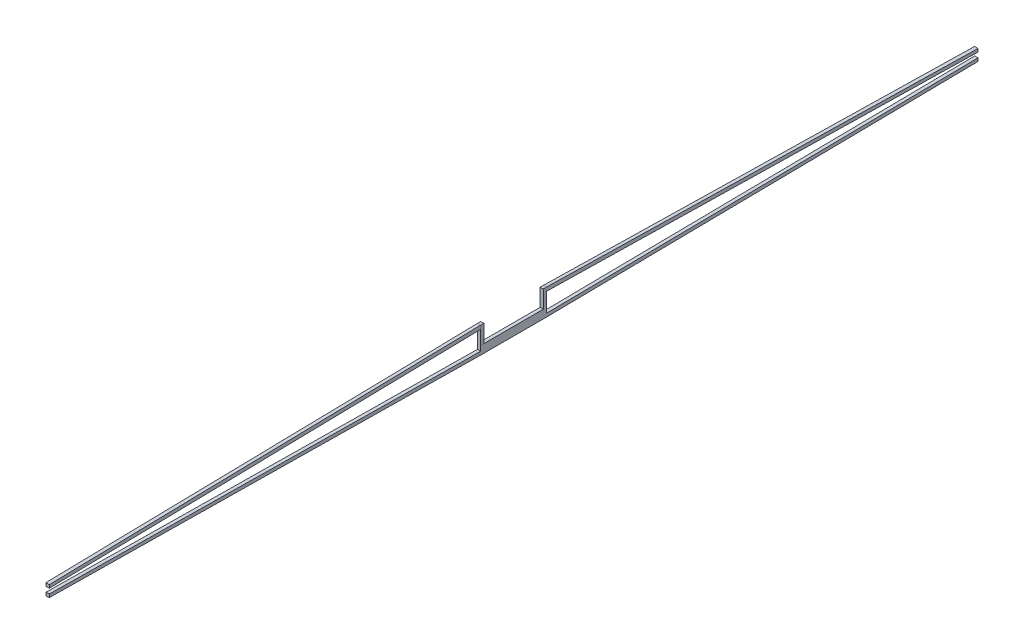
ISO-10303-21;
HEADER;
FILE_DESCRIPTION(('STEP AP214'),'2;1');
FILE_NAME('part.step','',(''),(''),'','','');
FILE_SCHEMA(('AUTOMOTIVE_DESIGN { 1 0 10303 214 1 1 1 1 }'));
ENDSEC;
DATA;
#1=APPLICATION_CONTEXT('core data for automotive mechanical design processes');
#2=APPLICATION_PROTOCOL_DEFINITION('international standard','automotive_design',2000,#1);
#3=PRODUCT_CONTEXT('',#1,'mechanical');
#4=PRODUCT('Part','Part','',(#3));
#5=PRODUCT_RELATED_PRODUCT_CATEGORY('part','',(#4));
#6=PRODUCT_DEFINITION_FORMATION('','',#4);
#7=PRODUCT_DEFINITION_CONTEXT('part definition',#1,'design');
#8=PRODUCT_DEFINITION('design','',#6,#7);
#9=PRODUCT_DEFINITION_SHAPE('','',#8);
#10=(LENGTH_UNIT() NAMED_UNIT(*) SI_UNIT(.MILLI.,.METRE.));
#11=(NAMED_UNIT(*) PLANE_ANGLE_UNIT() SI_UNIT($,.RADIAN.));
#12=(NAMED_UNIT(*) SI_UNIT($,.STERADIAN.) SOLID_ANGLE_UNIT());
#13=UNCERTAINTY_MEASURE_WITH_UNIT(LENGTH_MEASURE(1.E-05),#10,'distance_accuracy_value','');
#14=(GEOMETRIC_REPRESENTATION_CONTEXT(3) GLOBAL_UNCERTAINTY_ASSIGNED_CONTEXT((#13)) GLOBAL_UNIT_ASSIGNED_CONTEXT((#10,
#11,#12)) REPRESENTATION_CONTEXT('',''));
#15=CARTESIAN_POINT('',(0.,0.,0.));
#16=DIRECTION('',(0.,0.,1.));
#17=DIRECTION('',(1.,0.,0.));
#18=AXIS2_PLACEMENT_3D('',#15,#16,#17);
#19=CARTESIAN_POINT('',(82.1455000601854,25.9029302299447,-50.8));
#20=DIRECTION('',(0.,0.,1.));
#21=DIRECTION('',(1.,0.,0.));
#22=AXIS2_PLACEMENT_3D('',#19,#20,#21);
#23=PLANE('',#22);
#24=DIRECTION('',(-1.50204106967859E-09,-1.,0.));
#25=VECTOR('',#24,1.);
#26=CARTESIAN_POINT('',(82.1455000601854,25.9029302299447,-50.8));
#27=LINE('',#26,#25);
#28=CARTESIAN_POINT('',(82.1455000597855,25.6366987111868,-50.8));
#29=VERTEX_POINT('',#28);
#30=CARTESIAN_POINT('',(82.1455,25.6073743493255,-50.8));
#31=VERTEX_POINT('',#30);
#32=EDGE_CURVE('E219',#29,#31,#27,.T.);
#33=ORIENTED_EDGE('',*,*,#32,.F.);
#34=DIRECTION('',(0.998629534833184,0.0523359547429687,0.));
#35=VECTOR('',#34,1.);
#36=CARTESIAN_POINT('',(87.2255000600027,25.9029302223048,-50.8));
#37=LINE('',#36,#35);
#38=CARTESIAN_POINT('',(86.5200520974673,25.8659592622511,-50.8));
#39=VERTEX_POINT('',#38);
#40=EDGE_CURVE('E59',#29,#39,#37,.T.);
#41=ORIENTED_EDGE('',*,*,#40,.T.);
#42=DIRECTION('',(-0.998257499583598,-0.0590081733754045,0.));
#43=VECTOR('',#42,1.);
#44=CARTESIAN_POINT('',(87.1455,25.9029302224345,-50.8));
#45=LINE('',#44,#43);
#46=EDGE_CURVE('E442',#39,#31,#45,.T.);
#47=ORIENTED_EDGE('',*,*,#46,.T.);
#48=EDGE_LOOP('',(#33,#41,#47));
#49=FACE_BOUND('',#48,.T.);
#50=ADVANCED_FACE('F44',(#49),#23,.F.);
#51=CARTESIAN_POINT('',(82.1455000601854,25.9029302299447,-50.8));
#52=DIRECTION('',(1.,-1.50204106967859E-09,3.60544927254332E-12));
#53=DIRECTION('',(1.50204106967859E-09,1.,0.));
#54=AXIS2_PLACEMENT_3D('',#51,#52,#53);
#55=PLANE('',#54);
#56=DIRECTION('',(-1.50204106967859E-09,-1.,0.));
#57=VECTOR('',#56,1.);
#58=CARTESIAN_POINT('',(82.1455000601674,25.9029302299447,50.8));
#59=LINE('',#58,#57);
#60=CARTESIAN_POINT('',(82.1455000597675,25.6366987111868,50.8));
#61=VERTEX_POINT('',#60);
#62=CARTESIAN_POINT('',(82.1455,25.6073743493255,50.8));
#63=VERTEX_POINT('',#62);
#64=EDGE_CURVE('E340',#61,#63,#59,.T.);
#65=ORIENTED_EDGE('',*,*,#64,.F.);
#66=DIRECTION('',(3.60544927254332E-12,0.,-1.));
#67=VECTOR('',#66,1.);
#68=CARTESIAN_POINT('',(82.1455000597855,25.6366987111868,-50.8));
#69=LINE('',#68,#67);
#70=CARTESIAN_POINT('',(82.1455000597855,25.6366987111868,45.8000000001014));
#71=VERTEX_POINT('',#70);
#72=EDGE_CURVE('E459',#61,#71,#69,.T.);
#73=ORIENTED_EDGE('',*,*,#72,.T.);
#74=DIRECTION('',(-1.50204106967859E-09,-1.,0.));
#75=VECTOR('',#74,1.);
#76=CARTESIAN_POINT('',(82.1455000601854,25.9029302299447,45.8000000001014));
#77=LINE('',#76,#75);
#78=CARTESIAN_POINT('',(82.14550001954,-1.1571915695001,45.8000000001014));
#79=VERTEX_POINT('',#78);
#80=EDGE_CURVE('E475',#71,#79,#77,.T.);
#81=ORIENTED_EDGE('',*,*,#80,.T.);
#82=DIRECTION('',(0.,0.,-1.));
#83=VECTOR('',#82,1.);
#84=CARTESIAN_POINT('',(82.14550001954,-1.1571915695001,50.8));
#85=LINE('',#84,#83);
#86=CARTESIAN_POINT('',(82.14550001954,-1.1571915695001,-45.8000000001014));
#87=VERTEX_POINT('',#86);
#88=EDGE_CURVE('E590',#79,#87,#85,.T.);
#89=ORIENTED_EDGE('',*,*,#88,.T.);
#90=DIRECTION('',(-1.50204106967859E-09,-1.,0.));
#91=VECTOR('',#90,1.);
#92=CARTESIAN_POINT('',(82.1455000601674,25.9029302299447,-45.8000000001014));
#93=LINE('',#92,#91);
#94=CARTESIAN_POINT('',(82.1455000597675,25.6366987111868,-45.8000000001014));
#95=VERTEX_POINT('',#94);
#96=EDGE_CURVE('E754',#95,#87,#93,.T.);
#97=ORIENTED_EDGE('',*,*,#96,.F.);
#98=DIRECTION('',(3.60544927254332E-12,0.,-1.));
#99=VECTOR('',#98,1.);
#100=CARTESIAN_POINT('',(82.1455000597855,25.6366987111868,-50.8));
#101=LINE('',#100,#99);
#102=EDGE_CURVE('E464',#95,#29,#101,.T.);
#103=ORIENTED_EDGE('',*,*,#102,.T.);
#104=ORIENTED_EDGE('',*,*,#32,.T.);
#105=DIRECTION('',(0.,-0.0201235388023075,-0.999797501090132));
#106=VECTOR('',#105,1.);
#107=CARTESIAN_POINT('',(82.1455,18.9310445790997,-382.5));
#108=LINE('',#107,#106);
#109=CARTESIAN_POINT('',(82.1455,12.254714808874,-714.2));
#110=VERTEX_POINT('',#109);
#111=EDGE_CURVE('E210',#31,#110,#108,.T.);
#112=ORIENTED_EDGE('',*,*,#111,.T.);
#113=CARTESIAN_POINT('',(82.1455000420771,12.254714808874,-714.2));
#114=DIRECTION('',(-1.5020413416953E-09,-1.,0.));
#115=VECTOR('',#114,1.);
#116=LINE('',#113,#115);
#117=CARTESIAN_POINT('',(82.1455,7.07331462742083,-714.2));
#118=VERTEX_POINT('',#117);
#119=EDGE_CURVE('E215',#110,#118,#116,.T.);
#120=ORIENTED_EDGE('',*,*,#119,.T.);
#121=DIRECTION('',(0.,0.019821802884001,0.999803528764741));
#122=VECTOR('',#121,1.);
#123=CARTESIAN_POINT('',(82.1455,7.07331462742083,-714.2));
#124=LINE('',#123,#122);
#125=CARTESIAN_POINT('',(82.1455,20.2256827226734,-50.8));
#126=VERTEX_POINT('',#125);
#127=EDGE_CURVE('E449',#118,#126,#124,.T.);
#128=ORIENTED_EDGE('',*,*,#127,.T.);
#129=CARTESIAN_POINT('',(82.1455000078165,-8.96219700590387,-50.8));
#130=VERTEX_POINT('',#129);
#131=EDGE_CURVE('E435',#126,#130,#27,.T.);
#132=ORIENTED_EDGE('',*,*,#131,.T.);
#133=DIRECTION('',(0.,-0.0126739303792179,0.999919682518922));
#134=VECTOR('',#133,1.);
#135=CARTESIAN_POINT('',(82.1455,-0.553636237910325,-714.2));
#136=LINE('',#135,#134);
#137=CARTESIAN_POINT('',(82.1455,-0.553636237910325,-714.2));
#138=VERTEX_POINT('',#137);
#139=EDGE_CURVE('E658',#138,#130,#136,.T.);
#140=ORIENTED_EDGE('',*,*,#139,.F.);
#141=CARTESIAN_POINT('',(82.1455000228384,-0.553636237910327,-714.199999999999));
#142=DIRECTION('',(-1.50203987623917E-09,-1.,0.));
#143=VECTOR('',#142,1.);
#144=LINE('',#141,#143);
#145=CARTESIAN_POINT('',(82.1455,-5.68526939853498,-714.2));
#146=VERTEX_POINT('',#145);
#147=EDGE_CURVE('E385',#138,#146,#144,.T.);
#148=ORIENTED_EDGE('',*,*,#147,.T.);
#149=DIRECTION('',(0.,-0.0127828353753754,0.999918296222129));
#150=VECTOR('',#149,1.);
#151=CARTESIAN_POINT('',(82.1455,-9.92568235030488,-382.5));
#152=LINE('',#151,#150);
#153=CARTESIAN_POINT('',(82.1455000000001,-14.1660953020748,-50.8));
#154=VERTEX_POINT('',#153);
#155=EDGE_CURVE('E652',#146,#154,#152,.T.);
#156=ORIENTED_EDGE('',*,*,#155,.T.);
#157=CARTESIAN_POINT('',(82.1455000000001,-14.1660953020748,-50.8));
#158=DIRECTION('',(1.50192710613589E-09,1.,0.));
#159=VECTOR('',#158,1.);
#160=LINE('',#157,#159);
#161=CARTESIAN_POINT('',(82.1455,-14.0985509928599,-50.8));
#162=VERTEX_POINT('',#161);
#163=EDGE_CURVE('E558',#154,#162,#160,.T.);
#164=ORIENTED_EDGE('',*,*,#163,.T.);
#165=DIRECTION('',(0.,0.,-1.));
#166=VECTOR('',#165,1.);
#167=CARTESIAN_POINT('',(82.1455000001015,-14.0985509928599,50.8));
#168=LINE('',#167,#166);
#169=CARTESIAN_POINT('',(82.1455,-14.0985509928599,50.8));
#170=VERTEX_POINT('',#169);
#171=EDGE_CURVE('E568',#170,#162,#168,.T.);
#172=ORIENTED_EDGE('',*,*,#171,.F.);
#173=DIRECTION('',(0.,1.,0.));
#174=VECTOR('',#173,1.);
#175=CARTESIAN_POINT('',(82.1455000000001,-14.1660953020748,50.8));
#176=LINE('',#175,#174);
#177=CARTESIAN_POINT('',(82.1455000000001,-14.1660953020748,50.8));
#178=VERTEX_POINT('',#177);
#179=EDGE_CURVE('E595',#178,#170,#176,.T.);
#180=ORIENTED_EDGE('',*,*,#179,.F.);
#181=DIRECTION('',(0.,-0.0127828353753754,-0.999918296222129));
#182=VECTOR('',#181,1.);
#183=CARTESIAN_POINT('',(82.1455,-9.92568235030488,382.5));
#184=LINE('',#183,#182);
#185=CARTESIAN_POINT('',(82.1455,-5.68526939853498,714.2));
#186=VERTEX_POINT('',#185);
#187=EDGE_CURVE('E1082',#186,#178,#184,.T.);
#188=ORIENTED_EDGE('',*,*,#187,.F.);
#189=DIRECTION('',(0.,-1.,0.));
#190=VECTOR('',#189,1.);
#191=CARTESIAN_POINT('',(82.1455,-0.553636237910325,714.2));
#192=LINE('',#191,#190);
#193=CARTESIAN_POINT('',(82.1455,-0.553636237910325,714.2));
#194=VERTEX_POINT('',#193);
#195=EDGE_CURVE('E1154',#194,#186,#192,.T.);
#196=ORIENTED_EDGE('',*,*,#195,.F.);
#197=DIRECTION('',(0.,-0.0126739303792179,-0.999919682518922));
#198=VECTOR('',#197,1.);
#199=CARTESIAN_POINT('',(82.1455,-0.553636237910325,714.2));
#200=LINE('',#199,#198);
#201=CARTESIAN_POINT('',(82.1455,-8.96219700590387,50.8));
#202=VERTEX_POINT('',#201);
#203=EDGE_CURVE('E1089',#194,#202,#200,.T.);
#204=ORIENTED_EDGE('',*,*,#203,.T.);
#205=CARTESIAN_POINT('',(82.1455000516399,20.2256827226734,50.8));
#206=VERTEX_POINT('',#205);
#207=EDGE_CURVE('E476',#206,#202,#59,.T.);
#208=ORIENTED_EDGE('',*,*,#207,.F.);
#209=DIRECTION('',(0.,0.019821802884001,-0.999803528764741));
#210=VECTOR('',#209,1.);
#211=CARTESIAN_POINT('',(82.1455,7.07331462742083,714.2));
#212=LINE('',#211,#210);
#213=CARTESIAN_POINT('',(82.1455,7.07331462742083,714.2));
#214=VERTEX_POINT('',#213);
#215=EDGE_CURVE('E288',#214,#206,#212,.T.);
#216=ORIENTED_EDGE('',*,*,#215,.F.);
#217=DIRECTION('',(0.,-1.,0.));
#218=VECTOR('',#217,1.);
#219=CARTESIAN_POINT('',(82.1455,7.07331462742083,714.2));
#220=LINE('',#219,#218);
#221=CARTESIAN_POINT('',(82.1455,12.254714808874,714.2));
#222=VERTEX_POINT('',#221);
#223=EDGE_CURVE('E285',#222,#214,#220,.T.);
#224=ORIENTED_EDGE('',*,*,#223,.F.);
#225=DIRECTION('',(0.,-0.0201235388023075,0.999797501090132));
#226=VECTOR('',#225,1.);
#227=CARTESIAN_POINT('',(82.1455,18.9310445790997,382.5));
#228=LINE('',#227,#226);
#229=EDGE_CURVE('E277',#63,#222,#228,.T.);
#230=ORIENTED_EDGE('',*,*,#229,.F.);
#231=EDGE_LOOP('',(#65,#73,#81,#89,#97,#103,#104,#112,#120,#128,#132,#140,#148,#156,#164,#172,
#180,#188,#196,#204,#208,#216,#224,#230));
#232=FACE_BOUND('',#231,.T.);
#233=ADVANCED_FACE('F213',(#232),#55,.F.);
#234=CARTESIAN_POINT('',(82.1455000601674,25.9029302299447,-45.8000000001014));
#235=DIRECTION('',(0.,0.,-1.));
#236=DIRECTION('',(-1.,0.,0.));
#237=AXIS2_PLACEMENT_3D('',#234,#235,#236);
#238=PLANE('',#237);
#239=DIRECTION('',(-1.50204106967859E-09,-1.,0.));
#240=VECTOR('',#239,1.);
#241=CARTESIAN_POINT('',(87.145500060084,25.9029302224345,-45.8000000001014));
#242=LINE('',#241,#240);
#243=CARTESIAN_POINT('',(87.1455000600777,25.8987376000875,-45.8000000001014));
#244=VERTEX_POINT('',#243);
#245=CARTESIAN_POINT('',(87.1455000194386,-1.1571915770103,-45.8000000001014));
#246=VERTEX_POINT('',#245);
#247=EDGE_CURVE('E436',#244,#246,#242,.T.);
#248=ORIENTED_EDGE('',*,*,#247,.F.);
#249=DIRECTION('',(-0.998629534833184,-0.0523359547429687,0.));
#250=VECTOR('',#249,1.);
#251=CARTESIAN_POINT('',(87.2255000600027,25.9029302223057,-45.8000000001014));
#252=LINE('',#251,#250);
#253=EDGE_CURVE('E450',#244,#95,#252,.T.);
#254=ORIENTED_EDGE('',*,*,#253,.T.);
#255=ORIENTED_EDGE('',*,*,#96,.T.);
#256=DIRECTION('',(1.,-1.50204106967318E-09,0.));
#257=VECTOR('',#256,1.);
#258=CARTESIAN_POINT('',(82.1455000195219,-1.1571915695001,-45.8000000001014));
#259=LINE('',#258,#257);
#260=EDGE_CURVE('E466',#87,#246,#259,.T.);
#261=ORIENTED_EDGE('',*,*,#260,.T.);
#262=EDGE_LOOP('',(#248,#254,#255,#261));
#263=FACE_BOUND('',#262,.T.);
#264=ADVANCED_FACE('F361',(#263),#238,.F.);
#265=CARTESIAN_POINT('',(87.145500060084,25.9029302224345,-50.8));
#266=DIRECTION('',(-1.,1.50204106967859E-09,0.));
#267=DIRECTION('',(-1.50204106967859E-09,-1.,0.));
#268=AXIS2_PLACEMENT_3D('',#265,#266,#267);
#269=PLANE('',#268);
#270=DIRECTION('',(0.,0.0211313401598533,0.999776708301933));
#271=VECTOR('',#270,1.);
#272=CARTESIAN_POINT('',(87.1455,18.8920992310543,-382.5));
#273=LINE('',#272,#271);
#274=CARTESIAN_POINT('',(87.1455,11.881268239674,-714.2));
#275=VERTEX_POINT('',#274);
#276=CARTESIAN_POINT('',(87.1455,25.898737596938,-50.9983636289207));
#277=VERTEX_POINT('',#276);
#278=EDGE_CURVE('E220',#275,#277,#273,.T.);
#279=ORIENTED_EDGE('',*,*,#278,.T.);
#280=DIRECTION('',(0.,1.88953584276146E-13,1.));
#281=VECTOR('',#280,1.);
#282=CARTESIAN_POINT('',(87.1455000600777,25.8987376000962,3.14487907803036E-10));
#283=LINE('',#282,#281);
#284=EDGE_CURVE('E452',#277,#244,#283,.T.);
#285=ORIENTED_EDGE('',*,*,#284,.T.);
#286=ORIENTED_EDGE('',*,*,#247,.T.);
#287=DIRECTION('',(0.,0.,1.));
#288=VECTOR('',#287,1.);
#289=CARTESIAN_POINT('',(87.1455000194386,-1.1571915770103,50.8));
#290=LINE('',#289,#288);
#291=CARTESIAN_POINT('',(87.1455000194386,-1.1571915770103,45.8000000001014));
#292=VERTEX_POINT('',#291);
#293=EDGE_CURVE('E584',#246,#292,#290,.T.);
#294=ORIENTED_EDGE('',*,*,#293,.T.);
#295=DIRECTION('',(1.41440054116186E-08,0.,-1.));
#296=VECTOR('',#295,1.);
#297=CARTESIAN_POINT('',(87.1454999593546,-1.1571915770103,50.8));
#298=LINE('',#297,#296);
#299=CARTESIAN_POINT('',(87.1455000194386,-1.1571915770103,50.8));
#300=VERTEX_POINT('',#299);
#301=EDGE_CURVE('E491',#300,#292,#298,.T.);
#302=ORIENTED_EDGE('',*,*,#301,.F.);
#303=DIRECTION('',(1.50204107172094E-09,1.,0.));
#304=VECTOR('',#303,1.);
#305=CARTESIAN_POINT('',(87.1455000000001,-14.0985510003701,50.8));
#306=LINE('',#305,#304);
#307=CARTESIAN_POINT('',(87.1455000077151,-8.96219700590387,50.8));
#308=VERTEX_POINT('',#307);
#309=EDGE_CURVE('E577',#308,#300,#306,.T.);
#310=ORIENTED_EDGE('',*,*,#309,.F.);
#311=DIRECTION('',(0.,-0.0126739303792179,-0.999919682518922));
#312=VECTOR('',#311,1.);
#313=CARTESIAN_POINT('',(87.1455,-0.553636237910325,714.2));
#314=LINE('',#313,#312);
#315=CARTESIAN_POINT('',(87.1455,-0.553636237910325,714.2));
#316=VERTEX_POINT('',#315);
#317=EDGE_CURVE('E609',#316,#308,#314,.T.);
#318=ORIENTED_EDGE('',*,*,#317,.F.);
#319=DIRECTION('',(0.,1.,0.));
#320=VECTOR('',#319,1.);
#321=CARTESIAN_POINT('',(87.1455,-0.553636237910325,714.2));
#322=LINE('',#321,#320);
#323=CARTESIAN_POINT('',(87.1455,-5.41708896334215,714.2));
#324=VERTEX_POINT('',#323);
#325=EDGE_CURVE('E1092',#324,#316,#322,.T.);
#326=ORIENTED_EDGE('',*,*,#325,.F.);
#327=DIRECTION('',(0.,0.0130851956211474,0.999914385162828));
#328=VECTOR('',#327,1.);
#329=CARTESIAN_POINT('',(87.1455000000001,-9.7578199818561,382.5));
#330=LINE('',#329,#328);
#331=CARTESIAN_POINT('',(87.1455000000001,-14.0985510003701,50.8));
#332=VERTEX_POINT('',#331);
#333=EDGE_CURVE('E574',#332,#324,#330,.T.);
#334=ORIENTED_EDGE('',*,*,#333,.F.);
#335=DIRECTION('',(0.,0.,1.));
#336=VECTOR('',#335,1.);
#337=CARTESIAN_POINT('',(87.1455000000001,-14.0985510003701,50.8));
#338=LINE('',#337,#336);
#339=CARTESIAN_POINT('',(87.1455000000001,-14.0985510003701,-50.8));
#340=VERTEX_POINT('',#339);
#341=EDGE_CURVE('E566',#340,#332,#338,.T.);
#342=ORIENTED_EDGE('',*,*,#341,.F.);
#343=DIRECTION('',(0.,0.0130851956211474,-0.999914385162828));
#344=VECTOR('',#343,1.);
#345=CARTESIAN_POINT('',(87.1455000000001,-9.7578199818561,-382.5));
#346=LINE('',#345,#344);
#347=CARTESIAN_POINT('',(87.1455,-5.41708896334215,-714.2));
#348=VERTEX_POINT('',#347);
#349=EDGE_CURVE('E571',#340,#348,#346,.T.);
#350=ORIENTED_EDGE('',*,*,#349,.T.);
#351=CARTESIAN_POINT('',(87.14550001304,-5.41708896334215,-714.2));
#352=DIRECTION('',(1.50204008982759E-09,1.,0.));
#353=VECTOR('',#352,1.);
#354=LINE('',#351,#353);
#355=CARTESIAN_POINT('',(87.1455,-0.553636237910325,-714.2));
#356=VERTEX_POINT('',#355);
#357=EDGE_CURVE('E653',#348,#356,#354,.T.);
#358=ORIENTED_EDGE('',*,*,#357,.T.);
#359=DIRECTION('',(0.,-0.0126739303792179,0.999919682518922));
#360=VECTOR('',#359,1.);
#361=CARTESIAN_POINT('',(87.1455,-0.553636237910325,-714.2));
#362=LINE('',#361,#360);
#363=CARTESIAN_POINT('',(87.1455,-8.96219700590387,-50.8));
#364=VERTEX_POINT('',#363);
#365=EDGE_CURVE('E561',#356,#364,#362,.T.);
#366=ORIENTED_EDGE('',*,*,#365,.T.);
#367=DIRECTION('',(-1.50204106967859E-09,-1.,0.));
#368=VECTOR('',#367,1.);
#369=CARTESIAN_POINT('',(87.145500060084,25.9029302224345,-50.8));
#370=LINE('',#369,#368);
#371=CARTESIAN_POINT('',(87.1455000515565,20.2256827226734,-50.8));
#372=VERTEX_POINT('',#371);
#373=EDGE_CURVE('E433',#372,#364,#370,.T.);
#374=ORIENTED_EDGE('',*,*,#373,.F.);
#375=DIRECTION('',(0.,0.019821802884001,0.999803528764741));
#376=VECTOR('',#375,1.);
#377=CARTESIAN_POINT('',(87.1455,7.07331462742081,-714.2));
#378=LINE('',#377,#376);
#379=CARTESIAN_POINT('',(87.1455,7.07331462742081,-714.2));
#380=VERTEX_POINT('',#379);
#381=EDGE_CURVE('E1049',#380,#372,#378,.T.);
#382=ORIENTED_EDGE('',*,*,#381,.F.);
#383=CARTESIAN_POINT('',(87.1455000318011,7.07331462742081,-714.2));
#384=DIRECTION('',(1.50204256476213E-09,1.,0.));
#385=VECTOR('',#384,1.);
#386=LINE('',#383,#385);
#387=EDGE_CURVE('E230',#380,#275,#386,.T.);
#388=ORIENTED_EDGE('',*,*,#387,.T.);
#389=EDGE_LOOP('',(#279,#285,#286,#294,#302,#310,#318,#326,#334,#342,#350,#358,#366,#374,#382,#388));
#390=FACE_BOUND('',#389,.T.);
#391=ADVANCED_FACE('F356',(#390),#269,.F.);
#392=ORIENTED_EDGE('',*,*,#131,.F.);
#393=DIRECTION('',(1.,0.,0.));
#394=VECTOR('',#393,1.);
#395=CARTESIAN_POINT('',(82.1455000601854,20.2256827226734,-50.8));
#396=LINE('',#395,#394);
#397=EDGE_CURVE('E438',#126,#372,#396,.T.);
#398=ORIENTED_EDGE('',*,*,#397,.T.);
#399=ORIENTED_EDGE('',*,*,#373,.T.);
#400=DIRECTION('',(-1.,0.,0.));
#401=VECTOR('',#400,1.);
#402=CARTESIAN_POINT('',(0.,-8.96219700590387,-50.8));
#403=LINE('',#402,#401);
#404=EDGE_CURVE('E587',#130,#364,#403,.F.);
#405=ORIENTED_EDGE('',*,*,#404,.F.);
#406=EDGE_LOOP('',(#392,#398,#399,#405));
#407=FACE_BOUND('',#406,.T.);
#408=ADVANCED_FACE('F352',(#407),#23,.F.);
#409=CARTESIAN_POINT('',(87.1455,25.9029302224345,50.8));
#410=DIRECTION('',(0.,0.,-1.));
#411=DIRECTION('',(-1.,0.,0.));
#412=AXIS2_PLACEMENT_3D('',#409,#410,#411);
#413=PLANE('',#412);
#414=DIRECTION('',(-0.998257499583598,-0.0590081733754045,0.));
#415=VECTOR('',#414,1.);
#416=CARTESIAN_POINT('',(82.1455,25.6073743493255,50.8));
#417=LINE('',#416,#415);
#418=CARTESIAN_POINT('',(86.5200521003311,25.8659592624203,50.8));
#419=VERTEX_POINT('',#418);
#420=EDGE_CURVE('E290',#419,#63,#417,.T.);
#421=ORIENTED_EDGE('',*,*,#420,.F.);
#422=DIRECTION('',(0.998629534833184,0.0523359547429685,0.));
#423=VECTOR('',#422,1.);
#424=CARTESIAN_POINT('',(87.2255000600017,25.9029302223239,50.8));
#425=LINE('',#424,#423);
#426=EDGE_CURVE('E336',#419,#61,#425,.F.);
#427=ORIENTED_EDGE('',*,*,#426,.T.);
#428=ORIENTED_EDGE('',*,*,#64,.T.);
#429=EDGE_LOOP('',(#421,#427,#428));
#430=FACE_BOUND('',#429,.T.);
#431=ADVANCED_FACE('F355',(#430),#413,.F.);
#432=DIRECTION('',(-1.50204106967859E-09,-1.,0.));
#433=VECTOR('',#432,1.);
#434=CARTESIAN_POINT('',(87.1455,25.9029302224345,50.8));
#435=LINE('',#434,#433);
#436=CARTESIAN_POINT('',(87.1455,20.2256827226734,50.8));
#437=VERTEX_POINT('',#436);
#438=EDGE_CURVE('E492',#437,#300,#435,.T.);
#439=ORIENTED_EDGE('',*,*,#438,.F.);
#440=DIRECTION('',(1.,0.,0.));
#441=VECTOR('',#440,1.);
#442=CARTESIAN_POINT('',(87.1455,20.2256827226734,50.8));
#443=LINE('',#442,#441);
#444=EDGE_CURVE('E506',#206,#437,#443,.T.);
#445=ORIENTED_EDGE('',*,*,#444,.F.);
#446=ORIENTED_EDGE('',*,*,#207,.T.);
#447=DIRECTION('',(1.,0.,0.));
#448=VECTOR('',#447,1.);
#449=CARTESIAN_POINT('',(82.1455,-8.96219700590387,50.8));
#450=LINE('',#449,#448);
#451=EDGE_CURVE('E610',#202,#308,#450,.T.);
#452=ORIENTED_EDGE('',*,*,#451,.T.);
#453=ORIENTED_EDGE('',*,*,#309,.T.);
#454=EDGE_LOOP('',(#439,#445,#446,#452,#453));
#455=FACE_BOUND('',#454,.T.);
#456=ADVANCED_FACE('F400',(#455),#413,.F.);
#457=CARTESIAN_POINT('',(87.1455,25.9029302224345,50.8));
#458=DIRECTION('',(-1.,1.50204106967859E-09,-1.41440054116186E-08));
#459=DIRECTION('',(-1.41440054116186E-08,0.,1.));
#460=AXIS2_PLACEMENT_3D('',#457,#458,#459);
#461=PLANE('',#460);
#462=DIRECTION('',(-1.50204106967859E-09,-1.,0.));
#463=VECTOR('',#462,1.);
#464=CARTESIAN_POINT('',(87.14550007072,25.9029302224345,45.8000000001014));
#465=LINE('',#464,#463);
#466=CARTESIAN_POINT('',(87.1455000707137,25.8987376006622,45.8000000001014));
#467=VERTEX_POINT('',#466);
#468=EDGE_CURVE('E484',#467,#292,#465,.T.);
#469=ORIENTED_EDGE('',*,*,#468,.F.);
#470=DIRECTION('',(1.41440054127318E-08,7.410669389612E-10,-1.));
#471=VECTOR('',#470,1.);
#472=CARTESIAN_POINT('',(87.1455007185092,25.8987376346031,-8.20130991642095E-10));
#473=LINE('',#472,#471);
#474=CARTESIAN_POINT('',(87.1454999999968,25.8987375969572,50.8));
#475=VERTEX_POINT('',#474);
#476=EDGE_CURVE('E479',#467,#475,#473,.F.);
#477=ORIENTED_EDGE('',*,*,#476,.T.);
#478=CARTESIAN_POINT('',(87.1454999999937,25.8987375969572,50.8));
#479=DIRECTION('',(-1.50204011627916E-09,-1.,0.));
#480=VECTOR('',#479,1.);
#481=LINE('',#478,#480);
#482=EDGE_CURVE('E494',#475,#437,#481,.T.);
#483=ORIENTED_EDGE('',*,*,#482,.T.);
#484=ORIENTED_EDGE('',*,*,#438,.T.);
#485=ORIENTED_EDGE('',*,*,#301,.T.);
#486=EDGE_LOOP('',(#469,#477,#483,#484,#485));
#487=FACE_BOUND('',#486,.T.);
#488=ADVANCED_FACE('F488',(#487),#461,.F.);
#489=CARTESIAN_POINT('',(82.1455000601854,25.9029302299447,45.8000000001014));
#490=DIRECTION('',(0.,0.,1.));
#491=DIRECTION('',(1.,0.,0.));
#492=AXIS2_PLACEMENT_3D('',#489,#490,#491);
#493=PLANE('',#492);
#494=ORIENTED_EDGE('',*,*,#80,.F.);
#495=DIRECTION('',(-0.998629534833184,-0.0523359547429685,0.));
#496=VECTOR('',#495,1.);
#497=CARTESIAN_POINT('',(87.2255000600018,25.902930222323,45.8000000001014));
#498=LINE('',#497,#496);
#499=EDGE_CURVE('E457',#71,#467,#498,.F.);
#500=ORIENTED_EDGE('',*,*,#499,.T.);
#501=ORIENTED_EDGE('',*,*,#468,.T.);
#502=DIRECTION('',(-1.,1.50204106648344E-09,0.));
#503=VECTOR('',#502,1.);
#504=CARTESIAN_POINT('',(82.14550001954,-1.1571915695001,45.8000000001014));
#505=LINE('',#504,#503);
#506=EDGE_CURVE('E748',#292,#79,#505,.T.);
#507=ORIENTED_EDGE('',*,*,#506,.T.);
#508=EDGE_LOOP('',(#494,#500,#501,#507));
#509=FACE_BOUND('',#508,.T.);
#510=ADVANCED_FACE('F482',(#509),#493,.F.);
#511=CARTESIAN_POINT('',(-2.11766024553334E-08,-14.0985508694739,0.));
#512=DIRECTION('',(-1.50204106967859E-09,-1.,0.));
#513=DIRECTION('',(1.,-1.50204106967859E-09,0.));
#514=AXIS2_PLACEMENT_3D('',#511,#512,#513);
#515=PLANE('',#514);
#516=ORIENTED_EDGE('',*,*,#171,.T.);
#517=DIRECTION('',(1.,-1.50204106967859E-09,0.));
#518=VECTOR('',#517,1.);
#519=CARTESIAN_POINT('',(82.1455000001015,-14.0985509928599,-50.8));
#520=LINE('',#519,#518);
#521=EDGE_CURVE('E557',#162,#340,#520,.T.);
#522=ORIENTED_EDGE('',*,*,#521,.T.);
#523=ORIENTED_EDGE('',*,*,#341,.T.);
#524=DIRECTION('',(-1.,1.50204106967859E-09,0.));
#525=VECTOR('',#524,1.);
#526=CARTESIAN_POINT('',(82.1455000001015,-14.0985509928599,50.8));
#527=LINE('',#526,#525);
#528=EDGE_CURVE('E575',#332,#170,#527,.T.);
#529=ORIENTED_EDGE('',*,*,#528,.T.);
#530=EDGE_LOOP('',(#516,#522,#523,#529));
#531=FACE_BOUND('',#530,.T.);
#532=ADVANCED_FACE('F519',(#531),#515,.T.);
#533=CARTESIAN_POINT('',(-1.73814907754426E-09,-1.15719144611418,0.));
#534=DIRECTION('',(-1.50204106967859E-09,-1.,0.));
#535=DIRECTION('',(1.,-1.50204106967859E-09,0.));
#536=AXIS2_PLACEMENT_3D('',#533,#534,#535);
#537=PLANE('',#536);
#538=ORIENTED_EDGE('',*,*,#260,.F.);
#539=ORIENTED_EDGE('',*,*,#88,.F.);
#540=ORIENTED_EDGE('',*,*,#506,.F.);
#541=ORIENTED_EDGE('',*,*,#293,.F.);
#542=EDGE_LOOP('',(#538,#539,#540,#541));
#543=FACE_BOUND('',#542,.T.);
#544=ADVANCED_FACE('F520',(#543),#537,.F.);
#545=CARTESIAN_POINT('',(0.,0.,-50.8));
#546=DIRECTION('',(0.,0.,1.));
#547=DIRECTION('',(-1.,0.,0.));
#548=AXIS2_PLACEMENT_3D('',#545,#546,#547);
#549=PLANE('',#548);
#550=ORIENTED_EDGE('',*,*,#521,.F.);
#551=ORIENTED_EDGE('',*,*,#163,.F.);
#552=CARTESIAN_POINT('',(87.1455000000001,-14.0985510003701,-50.8));
#553=CARTESIAN_POINT('',(86.3121666666667,-14.1098083839875,-50.8));
#554=CARTESIAN_POINT('',(85.4788333333334,-14.121065767605,-50.8));
#555=CARTESIAN_POINT('',(83.8121666666667,-14.1435805348399,-50.8));
#556=CARTESIAN_POINT('',(82.9788333333334,-14.1548379184573,-50.8));
#557=CARTESIAN_POINT('',(82.1455000000001,-14.1660953020748,-50.8));
#558=B_SPLINE_CURVE_WITH_KNOTS('',3,(#552,#553,#554,#555,#556,#557),.UNSPECIFIED.,.F.,.F.,(4,2,
4),(0.,0.5,1.),.UNSPECIFIED.);
#559=EDGE_CURVE('E555',#340,#154,#558,.T.);
#560=ORIENTED_EDGE('',*,*,#559,.F.);
#561=EDGE_LOOP('',(#550,#551,#560));
#562=FACE_BOUND('',#561,.T.);
#563=ADVANCED_FACE('F523',(#562),#549,.T.);
#564=CARTESIAN_POINT('',(0.,0.,-714.2));
#565=DIRECTION('',(0.,0.,-1.));
#566=DIRECTION('',(1.,0.,0.));
#567=AXIS2_PLACEMENT_3D('',#564,#565,#566);
#568=PLANE('',#567);
#569=CARTESIAN_POINT('',(87.1455,-0.553636237910323,-714.2));
#570=DIRECTION('',(-1.,0.,0.));
#571=VECTOR('',#570,1.);
#572=LINE('',#569,#571);
#573=EDGE_CURVE('E724',#356,#138,#572,.T.);
#574=ORIENTED_EDGE('',*,*,#573,.F.);
#575=ORIENTED_EDGE('',*,*,#357,.F.);
#576=CARTESIAN_POINT('',(82.1455,-5.68526939853498,-714.2));
#577=CARTESIAN_POINT('',(82.9788333333328,-5.6405726593362,-714.2));
#578=CARTESIAN_POINT('',(83.8121666666659,-5.59587592013741,-714.2));
#579=CARTESIAN_POINT('',(85.4788333333326,-5.5064824417398,-714.2));
#580=CARTESIAN_POINT('',(86.3121666666662,-5.46178570254098,-714.2));
#581=CARTESIAN_POINT('',(87.1455,-5.41708896334215,-714.2));
#582=B_SPLINE_CURVE_WITH_KNOTS('',3,(#576,#577,#578,#579,#580,#581),.UNSPECIFIED.,.F.,.F.,(4,2,
4),(0.,0.5,1.),.UNSPECIFIED.);
#583=EDGE_CURVE('E662',#146,#348,#582,.T.);
#584=ORIENTED_EDGE('',*,*,#583,.F.);
#585=ORIENTED_EDGE('',*,*,#147,.F.);
#586=EDGE_LOOP('',(#574,#575,#584,#585));
#587=FACE_BOUND('',#586,.T.);
#588=ADVANCED_FACE('F531',(#587),#568,.T.);
#589=CARTESIAN_POINT('',(87.1455,-5.41708896334215,-714.2));
#590=CARTESIAN_POINT('',(87.1455000000001,-14.0985510003701,-50.8));
#591=CARTESIAN_POINT('',(86.3121666666662,-5.46178570254098,-714.2));
#592=CARTESIAN_POINT('',(86.3121666666667,-14.1098083839875,-50.8));
#593=CARTESIAN_POINT('',(85.4788333333326,-5.5064824417398,-714.2));
#594=CARTESIAN_POINT('',(85.4788333333334,-14.121065767605,-50.8));
#595=CARTESIAN_POINT('',(83.8121666666659,-5.59587592013741,-714.2));
#596=CARTESIAN_POINT('',(83.8121666666667,-14.1435805348399,-50.8));
#597=CARTESIAN_POINT('',(82.9788333333328,-5.6405726593362,-714.2));
#598=CARTESIAN_POINT('',(82.9788333333334,-14.1548379184573,-50.8));
#599=CARTESIAN_POINT('',(82.1455,-5.68526939853498,-714.2));
#600=CARTESIAN_POINT('',(82.1455000000001,-14.1660953020748,-50.8));
#601=B_SPLINE_SURFACE_WITH_KNOTS('',3,1,((#589,#590),(#591,#592),(#593,#594),(#595,#596),(#597,
#598),(#599,#600)),.UNSPECIFIED.,.F.,.F.,.F.,(4,2,4),(2,2),(0.,0.5,1.),(0.,1.),.UNSPECIFIED.);
#602=ORIENTED_EDGE('',*,*,#583,.T.);
#603=ORIENTED_EDGE('',*,*,#349,.F.);
#604=ORIENTED_EDGE('',*,*,#559,.T.);
#605=ORIENTED_EDGE('',*,*,#155,.F.);
#606=EDGE_LOOP('',(#602,#603,#604,#605));
#607=FACE_BOUND('',#606,.T.);
#608=ADVANCED_FACE('F668',(#607),#601,.F.);
#609=CARTESIAN_POINT('',(0.,-9.60454137354679,-0.12173706630717));
#610=DIRECTION('',(0.,-0.999919682518922,-0.0126739303792179));
#611=DIRECTION('',(0.,-0.0126739303792179,0.999919682518922));
#612=AXIS2_PLACEMENT_3D('',#609,#610,#611);
#613=PLANE('',#612);
#614=ORIENTED_EDGE('',*,*,#365,.F.);
#615=ORIENTED_EDGE('',*,*,#573,.T.);
#616=ORIENTED_EDGE('',*,*,#139,.T.);
#617=ORIENTED_EDGE('',*,*,#404,.T.);
#618=EDGE_LOOP('',(#614,#615,#616,#617));
#619=FACE_BOUND('',#618,.T.);
#620=ADVANCED_FACE('F533',(#619),#613,.F.);
#621=CARTESIAN_POINT('',(0.,0.,50.8));
#622=DIRECTION('',(0.,0.,-1.));
#623=DIRECTION('',(-1.,0.,0.));
#624=AXIS2_PLACEMENT_3D('',#621,#622,#623);
#625=PLANE('',#624);
#626=ORIENTED_EDGE('',*,*,#528,.F.);
#627=DIRECTION('',(-0.999908767832626,-0.0135076278983375,0.));
#628=VECTOR('',#627,1.);
#629=CARTESIAN_POINT('',(87.1455000000001,-14.0985510003701,50.8));
#630=LINE('',#629,#628);
#631=EDGE_CURVE('E605',#332,#178,#630,.T.);
#632=ORIENTED_EDGE('',*,*,#631,.T.);
#633=ORIENTED_EDGE('',*,*,#179,.T.);
#634=EDGE_LOOP('',(#626,#632,#633));
#635=FACE_BOUND('',#634,.T.);
#636=ADVANCED_FACE('F627',(#635),#625,.T.);
#637=CARTESIAN_POINT('',(0.,0.,714.2));
#638=DIRECTION('',(0.,0.,1.));
#639=DIRECTION('',(1.,0.,0.));
#640=AXIS2_PLACEMENT_3D('',#637,#638,#639);
#641=PLANE('',#640);
#642=DIRECTION('',(-1.,0.,0.));
#643=VECTOR('',#642,1.);
#644=CARTESIAN_POINT('',(87.1455,-0.553636237910325,714.2));
#645=LINE('',#644,#643);
#646=EDGE_CURVE('E1105',#316,#194,#645,.T.);
#647=ORIENTED_EDGE('',*,*,#646,.T.);
#648=ORIENTED_EDGE('',*,*,#195,.T.);
#649=DIRECTION('',(0.998564681218148,0.0535591021554554,0.));
#650=VECTOR('',#649,1.);
#651=CARTESIAN_POINT('',(82.1455,-5.68526939853498,714.2));
#652=LINE('',#651,#650);
#653=EDGE_CURVE('E1087',#186,#324,#652,.T.);
#654=ORIENTED_EDGE('',*,*,#653,.T.);
#655=ORIENTED_EDGE('',*,*,#325,.T.);
#656=EDGE_LOOP('',(#647,#648,#654,#655));
#657=FACE_BOUND('',#656,.T.);
#658=ADVANCED_FACE('F637',(#657),#641,.T.);
#659=CARTESIAN_POINT('',(87.1455,-5.41708896334215,714.2));
#660=CARTESIAN_POINT('',(87.1455000000001,-14.0985510003701,50.8));
#661=CARTESIAN_POINT('',(86.3121666666662,-5.46178570254098,714.2));
#662=CARTESIAN_POINT('',(86.3121666666667,-14.1098083839875,50.8));
#663=CARTESIAN_POINT('',(85.4788333333326,-5.5064824417398,714.2));
#664=CARTESIAN_POINT('',(85.4788333333334,-14.121065767605,50.8));
#665=CARTESIAN_POINT('',(83.8121666666659,-5.59587592013741,714.2));
#666=CARTESIAN_POINT('',(83.8121666666667,-14.1435805348399,50.8));
#667=CARTESIAN_POINT('',(82.9788333333328,-5.6405726593362,714.2));
#668=CARTESIAN_POINT('',(82.9788333333334,-14.1548379184573,50.8));
#669=CARTESIAN_POINT('',(82.1455,-5.68526939853498,714.2));
#670=CARTESIAN_POINT('',(82.1455000000001,-14.1660953020748,50.8));
#671=B_SPLINE_SURFACE_WITH_KNOTS('',3,1,((#659,#660),(#661,#662),(#663,#664),(#665,#666),(#667,
#668),(#669,#670)),.UNSPECIFIED.,.F.,.F.,.F.,(4,2,4),(2,2),(0.,0.5,1.),(0.,1.),.UNSPECIFIED.);
#672=ORIENTED_EDGE('',*,*,#653,.F.);
#673=ORIENTED_EDGE('',*,*,#187,.T.);
#674=ORIENTED_EDGE('',*,*,#631,.F.);
#675=ORIENTED_EDGE('',*,*,#333,.T.);
#676=EDGE_LOOP('',(#672,#673,#674,#675));
#677=FACE_BOUND('',#676,.T.);
#678=ADVANCED_FACE('F853',(#677),#671,.T.);
#679=CARTESIAN_POINT('',(0.,-9.60454137354679,0.12173706630717));
#680=DIRECTION('',(0.,-0.999919682518922,0.0126739303792179));
#681=DIRECTION('',(0.,-0.0126739303792179,-0.999919682518922));
#682=AXIS2_PLACEMENT_3D('',#679,#680,#681);
#683=PLANE('',#682);
#684=ORIENTED_EDGE('',*,*,#317,.T.);
#685=ORIENTED_EDGE('',*,*,#451,.F.);
#686=ORIENTED_EDGE('',*,*,#203,.F.);
#687=ORIENTED_EDGE('',*,*,#646,.F.);
#688=EDGE_LOOP('',(#684,#685,#686,#687));
#689=FACE_BOUND('',#688,.T.);
#690=ADVANCED_FACE('F638',(#689),#683,.F.);
#691=CARTESIAN_POINT('',(0.,0.,714.2));
#692=DIRECTION('',(0.,0.,1.));
#693=DIRECTION('',(1.,0.,0.));
#694=AXIS2_PLACEMENT_3D('',#691,#692,#693);
#695=PLANE('',#694);
#696=DIRECTION('',(1.,0.,0.));
#697=VECTOR('',#696,1.);
#698=CARTESIAN_POINT('',(82.1455,7.07331462742083,714.2));
#699=LINE('',#698,#697);
#700=CARTESIAN_POINT('',(87.1455,7.07331462742081,714.2));
#701=VERTEX_POINT('',#700);
#702=EDGE_CURVE('E441',#214,#701,#699,.T.);
#703=ORIENTED_EDGE('',*,*,#702,.T.);
#704=DIRECTION('',(0.,1.,0.));
#705=VECTOR('',#704,1.);
#706=CARTESIAN_POINT('',(87.1455,7.07331462742081,714.2));
#707=LINE('',#706,#705);
#708=CARTESIAN_POINT('',(87.1455,11.881268239674,714.2));
#709=VERTEX_POINT('',#708);
#710=EDGE_CURVE('E1207',#701,#709,#707,.T.);
#711=ORIENTED_EDGE('',*,*,#710,.T.);
#712=DIRECTION('',(-0.997222369058975,0.074481854490909,0.));
#713=VECTOR('',#712,1.);
#714=CARTESIAN_POINT('',(82.1455,12.254714808874,714.2));
#715=LINE('',#714,#713);
#716=EDGE_CURVE('E298',#709,#222,#715,.T.);
#717=ORIENTED_EDGE('',*,*,#716,.T.);
#718=ORIENTED_EDGE('',*,*,#223,.T.);
#719=EDGE_LOOP('',(#703,#711,#717,#718));
#720=FACE_BOUND('',#719,.T.);
#721=ADVANCED_FACE('F318',(#720),#695,.T.);
#722=CARTESIAN_POINT('',(82.1455,12.254714808874,714.2));
#723=CARTESIAN_POINT('',(82.1455,25.6073743493255,50.8));
#724=CARTESIAN_POINT('',(82.9788333333334,12.1924737140073,714.2));
#725=CARTESIAN_POINT('',(82.9788333333333,25.6566336615104,50.8));
#726=CARTESIAN_POINT('',(83.8121666666667,12.1302326191406,714.2));
#727=CARTESIAN_POINT('',(83.8121666666667,25.7058929736952,50.8));
#728=CARTESIAN_POINT('',(85.4788333333334,12.0057504294073,714.2));
#729=CARTESIAN_POINT('',(85.4788333333333,25.8044115980648,50.8));
#730=CARTESIAN_POINT('',(86.3121666666667,11.9435093345407,714.2));
#731=CARTESIAN_POINT('',(86.3121666666667,25.8536709102497,50.8));
#732=CARTESIAN_POINT('',(87.1455,11.881268239674,714.2));
#733=CARTESIAN_POINT('',(87.1455,25.9029302224345,50.8));
#734=B_SPLINE_SURFACE_WITH_KNOTS('',3,1,((#722,#723),(#724,#725),(#726,#727),(#728,#729),(#730,
#731),(#732,#733)),.UNSPECIFIED.,.F.,.F.,.F.,(4,2,4),(2,2),(0.,0.5,1.),(0.,1.),.UNSPECIFIED.);
#735=DIRECTION('',(0.,0.0211313401598533,-0.999776708301933));
#736=VECTOR('',#735,1.);
#737=CARTESIAN_POINT('',(87.1455,18.8920992310543,382.5));
#738=LINE('',#737,#736);
#739=CARTESIAN_POINT('',(87.1455,25.8987375969573,50.9983636280089));
#740=VERTEX_POINT('',#739);
#741=EDGE_CURVE('E284',#709,#740,#738,.T.);
#742=CARTESIAN_POINT('',(87.1455,25.8987375969573,50.998363628009));
#743=CARTESIAN_POINT('',(87.0412017951947,25.8932715598173,50.9654828865875));
#744=CARTESIAN_POINT('',(86.9369320344863,25.8878070133692,50.9325122135427));
#745=CARTESIAN_POINT('',(86.7284494012633,25.8768809018569,50.8663910042063));
#746=CARTESIAN_POINT('',(86.6242365287487,25.8714193367927,50.8332404679148));
#747=CARTESIAN_POINT('',(86.5200521003311,25.8659592624203,50.8));
#748=B_SPLINE_CURVE_WITH_KNOTS('',3,(#742,#743,#744,#745,#746,#747),.UNSPECIFIED.,.F.,.F.,(4,2,
4),(0.,0.328484376986031,0.656968753972082),.UNSPECIFIED.);
#749=EDGE_CURVE('E329',#740,#419,#748,.T.);
#750=ORIENTED_EDGE('',*,*,#741,.T.);
#751=ORIENTED_EDGE('',*,*,#749,.T.);
#752=ORIENTED_EDGE('',*,*,#420,.T.);
#753=ORIENTED_EDGE('',*,*,#229,.T.);
#754=ORIENTED_EDGE('',*,*,#716,.F.);
#755=EDGE_LOOP('',(#750,#751,#752,#753,#754));
#756=FACE_BOUND('',#755,.T.);
#757=ADVANCED_FACE('F305',(#756),#734,.T.);
#758=CARTESIAN_POINT('',(87.1455,0.,0.));
#759=DIRECTION('',(1.,0.,0.));
#760=DIRECTION('',(0.,0.,-1.));
#761=AXIS2_PLACEMENT_3D('',#758,#759,#760);
#762=PLANE('',#761);
#763=ORIENTED_EDGE('',*,*,#482,.F.);
#764=DIRECTION('',(0.,-1.88953584261271E-13,-1.));
#765=VECTOR('',#764,1.);
#766=CARTESIAN_POINT('',(87.1455,25.8987375969476,-4.89365929678539E-12));
#767=LINE('',#766,#765);
#768=EDGE_CURVE('E337',#475,#740,#767,.F.);
#769=ORIENTED_EDGE('',*,*,#768,.T.);
#770=ORIENTED_EDGE('',*,*,#741,.F.);
#771=ORIENTED_EDGE('',*,*,#710,.F.);
#772=DIRECTION('',(0.,0.019821802884001,-0.999803528764741));
#773=VECTOR('',#772,1.);
#774=CARTESIAN_POINT('',(87.1455,7.07331462742081,714.2));
#775=LINE('',#774,#773);
#776=EDGE_CURVE('E291',#701,#437,#775,.T.);
#777=ORIENTED_EDGE('',*,*,#776,.T.);
#778=EDGE_LOOP('',(#763,#769,#770,#771,#777));
#779=FACE_BOUND('',#778,.T.);
#780=ADVANCED_FACE('F317',(#779),#762,.T.);
#781=CARTESIAN_POINT('',(0.,21.224485723938,0.420790245513513));
#782=DIRECTION('',(0.,-0.999803528764741,-0.019821802884001));
#783=DIRECTION('',(0.,0.019821802884001,-0.999803528764741));
#784=AXIS2_PLACEMENT_3D('',#781,#782,#783);
#785=PLANE('',#784);
#786=ORIENTED_EDGE('',*,*,#215,.T.);
#787=ORIENTED_EDGE('',*,*,#444,.T.);
#788=ORIENTED_EDGE('',*,*,#776,.F.);
#789=ORIENTED_EDGE('',*,*,#702,.F.);
#790=EDGE_LOOP('',(#786,#787,#788,#789));
#791=FACE_BOUND('',#790,.T.);
#792=ADVANCED_FACE('F255',(#791),#785,.T.);
#793=CARTESIAN_POINT('',(0.,0.,-714.2));
#794=DIRECTION('',(0.,0.,-1.));
#795=DIRECTION('',(1.,0.,0.));
#796=AXIS2_PLACEMENT_3D('',#793,#794,#795);
#797=PLANE('',#796);
#798=CARTESIAN_POINT('',(82.1455,7.07331462742083,-714.2));
#799=DIRECTION('',(1.,0.,0.));
#800=VECTOR('',#799,1.);
#801=LINE('',#798,#800);
#802=EDGE_CURVE('E236',#118,#380,#801,.T.);
#803=ORIENTED_EDGE('',*,*,#802,.F.);
#804=ORIENTED_EDGE('',*,*,#119,.F.);
#805=CARTESIAN_POINT('',(87.1455,11.881268239674,-714.2));
#806=CARTESIAN_POINT('',(86.3121666666667,11.9435093345407,-714.2));
#807=CARTESIAN_POINT('',(85.4788333333334,12.0057504294073,-714.2));
#808=CARTESIAN_POINT('',(83.8121666666667,12.1302326191406,-714.2));
#809=CARTESIAN_POINT('',(82.9788333333334,12.1924737140073,-714.2));
#810=CARTESIAN_POINT('',(82.1455,12.254714808874,-714.2));
#811=B_SPLINE_CURVE_WITH_KNOTS('',3,(#805,#806,#807,#808,#809,#810),.UNSPECIFIED.,.F.,.F.,(4,2,
4),(0.,0.5,1.),.UNSPECIFIED.);
#812=EDGE_CURVE('E223',#275,#110,#811,.T.);
#813=ORIENTED_EDGE('',*,*,#812,.F.);
#814=ORIENTED_EDGE('',*,*,#387,.F.);
#815=EDGE_LOOP('',(#803,#804,#813,#814));
#816=FACE_BOUND('',#815,.T.);
#817=ADVANCED_FACE('F234',(#816),#797,.T.);
#818=CARTESIAN_POINT('',(82.1455,12.254714808874,-714.2));
#819=CARTESIAN_POINT('',(82.1455,25.6073743493255,-50.8));
#820=CARTESIAN_POINT('',(82.9788333333334,12.1924737140073,-714.2));
#821=CARTESIAN_POINT('',(82.9788333333333,25.6566336615104,-50.8));
#822=CARTESIAN_POINT('',(83.8121666666667,12.1302326191406,-714.2));
#823=CARTESIAN_POINT('',(83.8121666666667,25.7058929736952,-50.8));
#824=CARTESIAN_POINT('',(85.4788333333334,12.0057504294073,-714.2));
#825=CARTESIAN_POINT('',(85.4788333333333,25.8044115980648,-50.8));
#826=CARTESIAN_POINT('',(86.3121666666667,11.9435093345407,-714.2));
#827=CARTESIAN_POINT('',(86.3121666666667,25.8536709102497,-50.8));
#828=CARTESIAN_POINT('',(87.1455,11.881268239674,-714.2));
#829=CARTESIAN_POINT('',(87.1455,25.9029302224345,-50.8));
#830=B_SPLINE_SURFACE_WITH_KNOTS('',3,1,((#818,#819),(#820,#821),(#822,#823),(#824,#825),(#826,
#827),(#828,#829)),.UNSPECIFIED.,.F.,.F.,.F.,(4,2,4),(2,2),(0.,0.5,1.),(0.,1.),.UNSPECIFIED.);
#831=CARTESIAN_POINT('',(86.5200520974673,25.8659592622511,-50.8));
#832=CARTESIAN_POINT('',(86.6242365263617,25.8714193366484,-50.8332404680685));
#833=CARTESIAN_POINT('',(86.7284493993533,25.8768809017376,-50.8663910045129));
#834=CARTESIAN_POINT('',(86.9369320335308,25.8878070132999,-50.9325122141531));
#835=CARTESIAN_POINT('',(87.0412017947168,25.893271559773,-50.9654828873491));
#836=CARTESIAN_POINT('',(87.1455,25.898737596938,-50.9983636289208));
#837=B_SPLINE_CURVE_WITH_KNOTS('',3,(#831,#832,#833,#834,#835,#836),.UNSPECIFIED.,.F.,.F.,(4,2,
4),(0.,0.328484378490622,0.656968756981243),.UNSPECIFIED.);
#838=EDGE_CURVE('E11',#39,#277,#837,.T.);
#839=ORIENTED_EDGE('',*,*,#46,.F.);
#840=ORIENTED_EDGE('',*,*,#838,.T.);
#841=ORIENTED_EDGE('',*,*,#278,.F.);
#842=ORIENTED_EDGE('',*,*,#812,.T.);
#843=ORIENTED_EDGE('',*,*,#111,.F.);
#844=EDGE_LOOP('',(#839,#840,#841,#842,#843));
#845=FACE_BOUND('',#844,.T.);
#846=ADVANCED_FACE('F225',(#845),#830,.F.);
#847=CARTESIAN_POINT('',(0.,21.224485723938,-0.420790245513513));
#848=DIRECTION('',(0.,-0.999803528764741,0.019821802884001));
#849=DIRECTION('',(0.,0.019821802884001,0.999803528764741));
#850=AXIS2_PLACEMENT_3D('',#847,#848,#849);
#851=PLANE('',#850);
#852=ORIENTED_EDGE('',*,*,#127,.F.);
#853=ORIENTED_EDGE('',*,*,#802,.T.);
#854=ORIENTED_EDGE('',*,*,#381,.T.);
#855=ORIENTED_EDGE('',*,*,#397,.F.);
#856=EDGE_LOOP('',(#852,#853,#854,#855));
#857=FACE_BOUND('',#856,.T.);
#858=ADVANCED_FACE('F350',(#857),#851,.T.);
#859=CARTESIAN_POINT('',(87.2255000600022,25.9029302223143,3.14487115592018E-10));
#860=DIRECTION('',(0.0523359547429685,-0.998629534833184,1.88694629955896E-13));
#861=DIRECTION('',(-3.60544927254332E-12,0.,1.));
#862=AXIS2_PLACEMENT_3D('',#859,#860,#861);
#863=PLANE('',#862);
#864=ORIENTED_EDGE('',*,*,#499,.F.);
#865=ORIENTED_EDGE('',*,*,#72,.F.);
#866=ORIENTED_EDGE('',*,*,#426,.F.);
#867=ORIENTED_EDGE('',*,*,#749,.F.);
#868=ORIENTED_EDGE('',*,*,#768,.F.);
#869=ORIENTED_EDGE('',*,*,#476,.F.);
#870=EDGE_LOOP('',(#864,#865,#866,#867,#868,#869));
#871=FACE_BOUND('',#870,.T.);
#872=ADVANCED_FACE('F344',(#871),#863,.F.);
#873=CARTESIAN_POINT('',(87.2255000600022,25.9029302223143,3.14487115592018E-10));
#874=DIRECTION('',(-0.0523359547429687,0.998629534833184,-1.88694629955897E-13));
#875=DIRECTION('',(3.60544927254332E-12,0.,-1.));
#876=AXIS2_PLACEMENT_3D('',#873,#874,#875);
#877=PLANE('',#876);
#878=ORIENTED_EDGE('',*,*,#40,.F.);
#879=ORIENTED_EDGE('',*,*,#102,.F.);
#880=ORIENTED_EDGE('',*,*,#253,.F.);
#881=ORIENTED_EDGE('',*,*,#284,.F.);
#882=ORIENTED_EDGE('',*,*,#838,.F.);
#883=EDGE_LOOP('',(#878,#879,#880,#881,#882));
#884=FACE_BOUND('',#883,.T.);
#885=ADVANCED_FACE('F47',(#884),#877,.T.);
#886=CLOSED_SHELL('',(#50,#233,#264,#391,#408,#431,#456,#488,#510,#532,#544,#563,#588,#608,#620,
#636,#658,#678,#690,#721,#757,#780,#792,#817,#846,#858,#872,#885));
#887=MANIFOLD_SOLID_BREP('B2',#886);
#888=ADVANCED_BREP_SHAPE_REPRESENTATION('',(#18,#887),#14);
#889=SHAPE_DEFINITION_REPRESENTATION(#9,#888);
ENDSEC;
END-ISO-10303-21;
